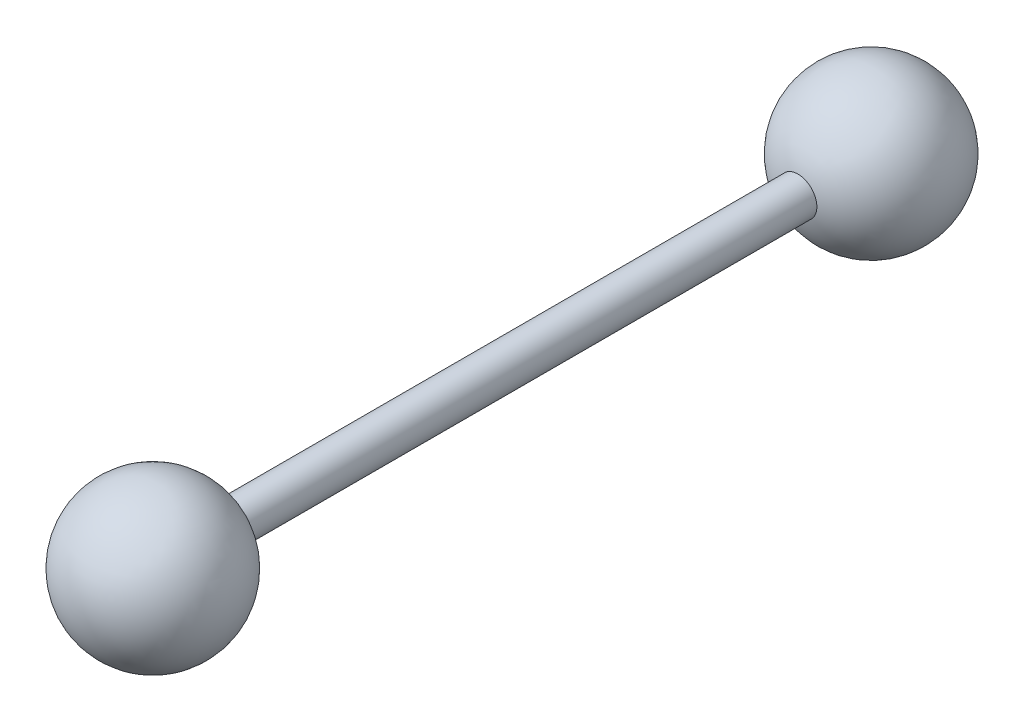
ISO-10303-21;
HEADER;
FILE_DESCRIPTION(('STEP AP214'),'2;1');
FILE_NAME('part.step','',(''),(''),'','','');
FILE_SCHEMA(('AUTOMOTIVE_DESIGN { 1 0 10303 214 1 1 1 1 }'));
ENDSEC;
DATA;
#1=APPLICATION_CONTEXT('core data for automotive mechanical design processes');
#2=APPLICATION_PROTOCOL_DEFINITION('international standard','automotive_design',2000,#1);
#3=PRODUCT_CONTEXT('',#1,'mechanical');
#4=PRODUCT('Part','Part','',(#3));
#5=PRODUCT_RELATED_PRODUCT_CATEGORY('part','',(#4));
#6=PRODUCT_DEFINITION_FORMATION('','',#4);
#7=PRODUCT_DEFINITION_CONTEXT('part definition',#1,'design');
#8=PRODUCT_DEFINITION('design','',#6,#7);
#9=PRODUCT_DEFINITION_SHAPE('','',#8);
#10=(LENGTH_UNIT() NAMED_UNIT(*) SI_UNIT(.MILLI.,.METRE.));
#11=(NAMED_UNIT(*) PLANE_ANGLE_UNIT() SI_UNIT($,.RADIAN.));
#12=(NAMED_UNIT(*) SI_UNIT($,.STERADIAN.) SOLID_ANGLE_UNIT());
#13=UNCERTAINTY_MEASURE_WITH_UNIT(LENGTH_MEASURE(1.E-05),#10,'distance_accuracy_value','');
#14=(GEOMETRIC_REPRESENTATION_CONTEXT(3) GLOBAL_UNCERTAINTY_ASSIGNED_CONTEXT((#13)) GLOBAL_UNIT_ASSIGNED_CONTEXT((#10,
#11,#12)) REPRESENTATION_CONTEXT('',''));
#15=CARTESIAN_POINT('',(0.,0.,0.));
#16=DIRECTION('',(0.,0.,1.));
#17=DIRECTION('',(1.,0.,0.));
#18=AXIS2_PLACEMENT_3D('',#15,#16,#17);
#19=CARTESIAN_POINT('',(-3.04635761589405,-5.36423841059603,190.));
#20=DIRECTION('',(0.,1.,0.));
#21=DIRECTION('',(1.,0.,0.));
#22=AXIS2_PLACEMENT_3D('',#19,#20,#21);
#23=SPHERICAL_SURFACE('',#22,20.);
#24=CARTESIAN_POINT('',(-3.04635761589405,14.635761589404,190.));
#25=VERTEX_POINT('',#24);
#26=VERTEX_LOOP('',#25);
#27=FACE_BOUND('',#26,.T.);
#28=ADVANCED_FACE('F42',(#27),#23,.T.);
#29=CLOSED_SHELL('',(#28));
#30=CARTESIAN_POINT('',(-3.04635761589406,-5.36423841059603,190.));
#31=DIRECTION('',(0.,1.,0.));
#32=DIRECTION('',(1.,0.,0.));
#33=AXIS2_PLACEMENT_3D('',#30,#31,#32);
#34=SPHERICAL_SURFACE('',#33,16.);
#35=CARTESIAN_POINT('',(-3.04635761589406,10.635761589404,190.));
#36=VERTEX_POINT('',#35);
#37=VERTEX_LOOP('',#36);
#38=FACE_BOUND('',#37,.T.);
#39=ADVANCED_FACE('F55',(#38),#34,.F.);
#40=CLOSED_SHELL('',(#39));
#41=ORIENTED_CLOSED_SHELL('',*,#40,.T.);
#42=BREP_WITH_VOIDS('B2',#29,(#41));
#43=CARTESIAN_POINT('',(-3.04635761589404,-5.36423841059603,0.));
#44=DIRECTION('',(0.,1.,0.));
#45=DIRECTION('',(1.,0.,0.));
#46=AXIS2_PLACEMENT_3D('',#43,#44,#45);
#47=SPHERICAL_SURFACE('',#46,20.);
#48=CARTESIAN_POINT('',(-3.04635761589404,-5.36423841059603,0.));
#49=DIRECTION('',(0.,0.,-1.));
#50=DIRECTION('',(-1.,0.,0.));
#51=AXIS2_PLACEMENT_3D('',#48,#49,#50);
#52=SPHERICAL_SURFACE('',#51,20.);
#53=CARTESIAN_POINT('',(-3.04635761589404,-5.36423841059603,19.3649167310371));
#54=DIRECTION('',(0.,0.,-1.));
#55=DIRECTION('',(-1.,0.,0.));
#56=AXIS2_PLACEMENT_3D('',#53,#54,#55);
#57=CIRCLE('',#56,5.);
#58=CARTESIAN_POINT('',(-8.04635761589404,-5.36423841059603,19.3649167310371));
#59=VERTEX_POINT('',#58);
#60=EDGE_CURVE('E70',#59,#59,#57,.T.);
#61=ORIENTED_EDGE('',*,*,#60,.T.);
#62=EDGE_LOOP('',(#61));
#63=FACE_BOUND('',#62,.T.);
#64=ADVANCED_FACE('F67',(#63),#52,.T.);
#65=CARTESIAN_POINT('',(-3.04635761589404,-5.36423841059603,16.));
#66=DIRECTION('',(0.,0.,1.));
#67=DIRECTION('',(1.,0.,0.));
#68=AXIS2_PLACEMENT_3D('',#65,#66,#67);
#69=CYLINDRICAL_SURFACE('',#68,5.);
#70=ORIENTED_EDGE('',*,*,#60,.F.);
#71=EDGE_LOOP('',(#70));
#72=FACE_BOUND('',#71,.T.);
#73=CARTESIAN_POINT('',(-3.04635761589404,-5.36423841059603,174.));
#74=DIRECTION('',(0.,0.,1.));
#75=DIRECTION('',(1.,0.,0.));
#76=AXIS2_PLACEMENT_3D('',#73,#74,#75);
#77=CIRCLE('',#76,5.);
#78=CARTESIAN_POINT('',(1.95364238410596,-5.36423841059603,174.));
#79=VERTEX_POINT('',#78);
#80=EDGE_CURVE('E78',#79,#79,#77,.T.);
#81=ORIENTED_EDGE('',*,*,#80,.F.);
#82=EDGE_LOOP('',(#81));
#83=FACE_BOUND('',#82,.T.);
#84=ADVANCED_FACE('F91',(#72,#83),#69,.T.);
#85=CARTESIAN_POINT('',(-3.04635761589404,-5.36423841059603,174.));
#86=DIRECTION('',(0.,0.,1.));
#87=DIRECTION('',(1.,0.,0.));
#88=AXIS2_PLACEMENT_3D('',#85,#86,#87);
#89=PLANE('',#88);
#90=ORIENTED_EDGE('',*,*,#80,.T.);
#91=EDGE_LOOP('',(#90));
#92=FACE_BOUND('',#91,.T.);
#93=CARTESIAN_POINT('',(-3.04635761589404,-5.36423841059603,174.));
#94=DIRECTION('',(0.,0.,1.));
#95=DIRECTION('',(1.,0.,0.));
#96=AXIS2_PLACEMENT_3D('',#93,#94,#95);
#97=CIRCLE('',#96,3.5);
#98=CARTESIAN_POINT('',(0.453642384105956,-5.36423841059603,174.));
#99=VERTEX_POINT('',#98);
#100=EDGE_CURVE('E82',#99,#99,#97,.T.);
#101=ORIENTED_EDGE('',*,*,#100,.F.);
#102=EDGE_LOOP('',(#101));
#103=FACE_BOUND('',#102,.T.);
#104=ADVANCED_FACE('F88',(#92,#103),#89,.T.);
#105=CARTESIAN_POINT('',(-3.04635761589404,-5.36423841059603,0.));
#106=DIRECTION('',(0.,0.,-1.));
#107=DIRECTION('',(-1.,0.,0.));
#108=AXIS2_PLACEMENT_3D('',#105,#106,#107);
#109=SPHERICAL_SURFACE('',#108,20.);
#110=CARTESIAN_POINT('',(-3.04635761589404,-5.36423841059603,19.6913686675152));
#111=DIRECTION('',(0.,0.,-1.));
#112=DIRECTION('',(-1.,0.,0.));
#113=AXIS2_PLACEMENT_3D('',#110,#111,#112);
#114=CIRCLE('',#113,3.5);
#115=CARTESIAN_POINT('',(-6.54635761589404,-5.36423841059603,19.6913686675152));
#116=VERTEX_POINT('',#115);
#117=EDGE_CURVE('E40',#116,#116,#114,.T.);
#118=ORIENTED_EDGE('',*,*,#117,.F.);
#119=EDGE_LOOP('',(#118));
#120=FACE_BOUND('',#119,.T.);
#121=ADVANCED_FACE('F90',(#120),#109,.T.);
#122=CARTESIAN_POINT('',(-3.04635761589404,-5.36423841059603,16.));
#123=DIRECTION('',(0.,0.,1.));
#124=DIRECTION('',(1.,0.,0.));
#125=AXIS2_PLACEMENT_3D('',#122,#123,#124);
#126=CYLINDRICAL_SURFACE('',#125,3.5);
#127=ORIENTED_EDGE('',*,*,#117,.T.);
#128=EDGE_LOOP('',(#127));
#129=FACE_BOUND('',#128,.T.);
#130=ORIENTED_EDGE('',*,*,#100,.T.);
#131=EDGE_LOOP('',(#130));
#132=FACE_BOUND('',#131,.T.);
#133=ADVANCED_FACE('F86',(#129,#132),#126,.F.);
#134=CLOSED_SHELL('',(#64,#84,#104,#121,#133));
#135=CARTESIAN_POINT('',(-3.04635761589402,-5.36423841059603,0.));
#136=DIRECTION('',(0.,1.,0.));
#137=DIRECTION('',(-1.,0.,0.));
#138=AXIS2_PLACEMENT_3D('',#135,#136,#137);
#139=SPHERICAL_SURFACE('',#138,16.);
#140=CARTESIAN_POINT('',(-3.04635761589402,10.635761589404,0.));
#141=VERTEX_POINT('',#140);
#142=VERTEX_LOOP('',#141);
#143=FACE_BOUND('',#142,.T.);
#144=ADVANCED_FACE('F136',(#143),#139,.F.);
#145=CLOSED_SHELL('',(#144));
#146=ORIENTED_CLOSED_SHELL('',*,#145,.T.);
#147=BREP_WITH_VOIDS('B6',#134,(#146));
#148=ADVANCED_BREP_SHAPE_REPRESENTATION('',(#18,#42,#147),#14);
#149=SHAPE_DEFINITION_REPRESENTATION(#9,#148);
ENDSEC;
END-ISO-10303-21;
